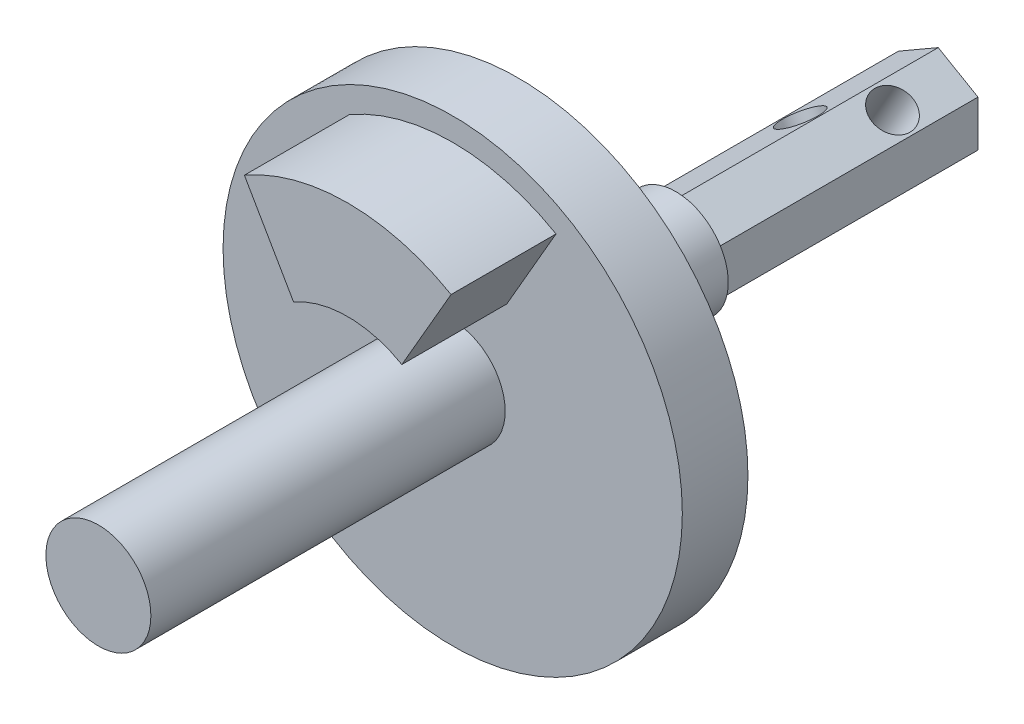
ISO-10303-21;
HEADER;
FILE_DESCRIPTION(('STEP AP214'),'2;1');
FILE_NAME('part.step','',(''),(''),'','','');
FILE_SCHEMA(('AUTOMOTIVE_DESIGN { 1 0 10303 214 1 1 1 1 }'));
ENDSEC;
DATA;
#1=APPLICATION_CONTEXT('core data for automotive mechanical design processes');
#2=APPLICATION_PROTOCOL_DEFINITION('international standard','automotive_design',2000,#1);
#3=PRODUCT_CONTEXT('',#1,'mechanical');
#4=PRODUCT('Part','Part','',(#3));
#5=PRODUCT_RELATED_PRODUCT_CATEGORY('part','',(#4));
#6=PRODUCT_DEFINITION_FORMATION('','',#4);
#7=PRODUCT_DEFINITION_CONTEXT('part definition',#1,'design');
#8=PRODUCT_DEFINITION('design','',#6,#7);
#9=PRODUCT_DEFINITION_SHAPE('','',#8);
#10=(LENGTH_UNIT() NAMED_UNIT(*) SI_UNIT(.MILLI.,.METRE.));
#11=(NAMED_UNIT(*) PLANE_ANGLE_UNIT() SI_UNIT($,.RADIAN.));
#12=(NAMED_UNIT(*) SI_UNIT($,.STERADIAN.) SOLID_ANGLE_UNIT());
#13=UNCERTAINTY_MEASURE_WITH_UNIT(LENGTH_MEASURE(1.E-05),#10,'distance_accuracy_value','');
#14=(GEOMETRIC_REPRESENTATION_CONTEXT(3) GLOBAL_UNCERTAINTY_ASSIGNED_CONTEXT((#13)) GLOBAL_UNIT_ASSIGNED_CONTEXT((#10,
#11,#12)) REPRESENTATION_CONTEXT('',''));
#15=CARTESIAN_POINT('',(0.,0.,0.));
#16=DIRECTION('',(0.,0.,1.));
#17=DIRECTION('',(1.,0.,0.));
#18=AXIS2_PLACEMENT_3D('',#15,#16,#17);
#19=CARTESIAN_POINT('',(0.,0.,2.5));
#20=DIRECTION('',(0.,0.,1.));
#21=DIRECTION('',(1.,0.,0.));
#22=AXIS2_PLACEMENT_3D('',#19,#20,#21);
#23=PLANE('',#22);
#24=CARTESIAN_POINT('',(0.,0.,2.5));
#25=DIRECTION('',(0.,0.,1.));
#26=DIRECTION('',(1.,0.,0.));
#27=AXIS2_PLACEMENT_3D('',#24,#25,#26);
#28=CIRCLE('',#27,4.);
#29=CARTESIAN_POINT('',(4.,0.,2.5));
#30=VERTEX_POINT('',#29);
#31=EDGE_CURVE('E147',#30,#30,#28,.T.);
#32=ORIENTED_EDGE('',*,*,#31,.F.);
#33=EDGE_LOOP('',(#32));
#34=FACE_BOUND('',#33,.T.);
#35=CARTESIAN_POINT('',(0.,0.,2.5));
#36=DIRECTION('',(0.,0.,1.));
#37=DIRECTION('',(1.,0.,0.));
#38=AXIS2_PLACEMENT_3D('',#35,#36,#37);
#39=CIRCLE('',#38,17.5);
#40=CARTESIAN_POINT('',(17.5,0.,2.5));
#41=VERTEX_POINT('',#40);
#42=EDGE_CURVE('E49',#41,#41,#39,.T.);
#43=ORIENTED_EDGE('',*,*,#42,.T.);
#44=EDGE_LOOP('',(#43));
#45=FACE_BOUND('',#44,.T.);
#46=DIRECTION('',(0.499999999999996,-0.866025403784441,0.));
#47=VECTOR('',#46,1.);
#48=CARTESIAN_POINT('',(-4.12499999999996,7.14470958122165,2.5));
#49=LINE('',#48,#47);
#50=CARTESIAN_POINT('',(-7.87499999999993,13.639900109605,2.5));
#51=VERTEX_POINT('',#50);
#52=CARTESIAN_POINT('',(-4.12499999999996,7.14470958122165,2.5));
#53=VERTEX_POINT('',#52);
#54=EDGE_CURVE('E179',#51,#53,#49,.T.);
#55=ORIENTED_EDGE('',*,*,#54,.F.);
#56=CARTESIAN_POINT('',(0.,0.,2.5));
#57=DIRECTION('',(0.,0.,1.));
#58=DIRECTION('',(-1.,0.,0.));
#59=AXIS2_PLACEMENT_3D('',#56,#57,#58);
#60=CIRCLE('',#59,15.75);
#61=CARTESIAN_POINT('',(7.87499999999993,13.639900109605,2.5));
#62=VERTEX_POINT('',#61);
#63=EDGE_CURVE('E157',#62,#51,#60,.T.);
#64=ORIENTED_EDGE('',*,*,#63,.F.);
#65=DIRECTION('',(0.499999999999995,0.866025403784441,0.));
#66=VECTOR('',#65,1.);
#67=CARTESIAN_POINT('',(7.87499999999993,13.639900109605,2.5));
#68=LINE('',#67,#66);
#69=CARTESIAN_POINT('',(4.12499999999996,7.14470958122164,2.5));
#70=VERTEX_POINT('',#69);
#71=EDGE_CURVE('E166',#70,#62,#68,.T.);
#72=ORIENTED_EDGE('',*,*,#71,.F.);
#73=CARTESIAN_POINT('',(0.,0.,2.5));
#74=DIRECTION('',(0.,0.,-1.));
#75=DIRECTION('',(1.,0.,0.));
#76=AXIS2_PLACEMENT_3D('',#73,#74,#75);
#77=CIRCLE('',#76,8.25);
#78=EDGE_CURVE('E182',#53,#70,#77,.T.);
#79=ORIENTED_EDGE('',*,*,#78,.F.);
#80=EDGE_LOOP('',(#55,#64,#72,#79));
#81=FACE_BOUND('',#80,.T.);
#82=ADVANCED_FACE('F39',(#34,#45,#81),#23,.T.);
#83=CARTESIAN_POINT('',(0.,0.,2.5));
#84=DIRECTION('',(0.,0.,-1.));
#85=DIRECTION('',(-1.,0.,0.));
#86=AXIS2_PLACEMENT_3D('',#83,#84,#85);
#87=CYLINDRICAL_SURFACE('',#86,17.5);
#88=ORIENTED_EDGE('',*,*,#42,.F.);
#89=EDGE_LOOP('',(#88));
#90=FACE_BOUND('',#89,.T.);
#91=CARTESIAN_POINT('',(0.,0.,-2.5));
#92=DIRECTION('',(0.,0.,1.));
#93=DIRECTION('',(1.,0.,0.));
#94=AXIS2_PLACEMENT_3D('',#91,#92,#93);
#95=CIRCLE('',#94,17.5);
#96=CARTESIAN_POINT('',(17.5,0.,-2.5));
#97=VERTEX_POINT('',#96);
#98=EDGE_CURVE('E43',#97,#97,#95,.T.);
#99=ORIENTED_EDGE('',*,*,#98,.T.);
#100=EDGE_LOOP('',(#99));
#101=FACE_BOUND('',#100,.T.);
#102=ADVANCED_FACE('F41',(#90,#101),#87,.T.);
#103=CARTESIAN_POINT('',(0.,0.,-2.5));
#104=DIRECTION('',(0.,0.,1.));
#105=DIRECTION('',(1.,0.,0.));
#106=AXIS2_PLACEMENT_3D('',#103,#104,#105);
#107=PLANE('',#106);
#108=CARTESIAN_POINT('',(0.,0.,-2.5));
#109=DIRECTION('',(0.,0.,-1.));
#110=DIRECTION('',(-1.,0.,0.));
#111=AXIS2_PLACEMENT_3D('',#108,#109,#110);
#112=CIRCLE('',#111,4.);
#113=CARTESIAN_POINT('',(-4.,0.,-2.5));
#114=VERTEX_POINT('',#113);
#115=EDGE_CURVE('E11',#114,#114,#112,.T.);
#116=ORIENTED_EDGE('',*,*,#115,.F.);
#117=EDGE_LOOP('',(#116));
#118=FACE_BOUND('',#117,.T.);
#119=ORIENTED_EDGE('',*,*,#98,.F.);
#120=EDGE_LOOP('',(#119));
#121=FACE_BOUND('',#120,.T.);
#122=ADVANCED_FACE('F209',(#118,#121),#107,.F.);
#123=CARTESIAN_POINT('',(0.,0.,10.5));
#124=DIRECTION('',(0.,0.,-1.));
#125=DIRECTION('',(-1.,0.,0.));
#126=AXIS2_PLACEMENT_3D('',#123,#124,#125);
#127=CYLINDRICAL_SURFACE('',#126,15.75);
#128=ORIENTED_EDGE('',*,*,#63,.T.);
#129=DIRECTION('',(0.,0.,-1.));
#130=VECTOR('',#129,1.);
#131=CARTESIAN_POINT('',(-7.87499999999993,13.639900109605,10.5));
#132=LINE('',#131,#130);
#133=CARTESIAN_POINT('',(-7.87499999999993,13.639900109605,10.5));
#134=VERTEX_POINT('',#133);
#135=EDGE_CURVE('E198',#134,#51,#132,.T.);
#136=ORIENTED_EDGE('',*,*,#135,.F.);
#137=CARTESIAN_POINT('',(0.,0.,10.5));
#138=DIRECTION('',(0.,0.,1.));
#139=DIRECTION('',(-1.,0.,0.));
#140=AXIS2_PLACEMENT_3D('',#137,#138,#139);
#141=CIRCLE('',#140,15.75);
#142=CARTESIAN_POINT('',(7.87499999999993,13.639900109605,10.5));
#143=VERTEX_POINT('',#142);
#144=EDGE_CURVE('E161',#143,#134,#141,.T.);
#145=ORIENTED_EDGE('',*,*,#144,.F.);
#146=DIRECTION('',(0.,0.,-1.));
#147=VECTOR('',#146,1.);
#148=CARTESIAN_POINT('',(7.87499999999993,13.639900109605,10.5));
#149=LINE('',#148,#147);
#150=EDGE_CURVE('E175',#143,#62,#149,.T.);
#151=ORIENTED_EDGE('',*,*,#150,.T.);
#152=EDGE_LOOP('',(#128,#136,#145,#151));
#153=FACE_BOUND('',#152,.T.);
#154=ADVANCED_FACE('F211',(#153),#127,.T.);
#155=CARTESIAN_POINT('',(-4.12499999999996,7.14470958122165,10.5));
#156=DIRECTION('',(0.866025403784441,0.499999999999996,0.));
#157=DIRECTION('',(-0.499999999999996,0.866025403784441,0.));
#158=AXIS2_PLACEMENT_3D('',#155,#156,#157);
#159=PLANE('',#158);
#160=ORIENTED_EDGE('',*,*,#54,.T.);
#161=DIRECTION('',(0.,0.,-1.));
#162=VECTOR('',#161,1.);
#163=CARTESIAN_POINT('',(-4.12499999999996,7.14470958122165,10.5));
#164=LINE('',#163,#162);
#165=CARTESIAN_POINT('',(-4.12499999999996,7.14470958122165,10.5));
#166=VERTEX_POINT('',#165);
#167=EDGE_CURVE('E194',#166,#53,#164,.T.);
#168=ORIENTED_EDGE('',*,*,#167,.F.);
#169=DIRECTION('',(0.499999999999996,-0.866025403784441,0.));
#170=VECTOR('',#169,1.);
#171=CARTESIAN_POINT('',(-4.12499999999996,7.14470958122165,10.5));
#172=LINE('',#171,#170);
#173=EDGE_CURVE('E165',#134,#166,#172,.T.);
#174=ORIENTED_EDGE('',*,*,#173,.F.);
#175=ORIENTED_EDGE('',*,*,#135,.T.);
#176=EDGE_LOOP('',(#160,#168,#174,#175));
#177=FACE_BOUND('',#176,.T.);
#178=ADVANCED_FACE('F217',(#177),#159,.F.);
#179=CARTESIAN_POINT('',(0.,0.,10.5));
#180=DIRECTION('',(0.,0.,-1.));
#181=DIRECTION('',(-1.,0.,0.));
#182=AXIS2_PLACEMENT_3D('',#179,#180,#181);
#183=CYLINDRICAL_SURFACE('',#182,8.25);
#184=ORIENTED_EDGE('',*,*,#78,.T.);
#185=DIRECTION('',(0.,0.,-1.));
#186=VECTOR('',#185,1.);
#187=CARTESIAN_POINT('',(4.12499999999996,7.14470958122164,10.5));
#188=LINE('',#187,#186);
#189=CARTESIAN_POINT('',(4.12499999999996,7.14470958122164,10.5));
#190=VERTEX_POINT('',#189);
#191=EDGE_CURVE('E191',#190,#70,#188,.T.);
#192=ORIENTED_EDGE('',*,*,#191,.F.);
#193=CARTESIAN_POINT('',(0.,0.,10.5));
#194=DIRECTION('',(0.,0.,-1.));
#195=DIRECTION('',(1.,0.,0.));
#196=AXIS2_PLACEMENT_3D('',#193,#194,#195);
#197=CIRCLE('',#196,8.25);
#198=EDGE_CURVE('E169',#166,#190,#197,.T.);
#199=ORIENTED_EDGE('',*,*,#198,.F.);
#200=ORIENTED_EDGE('',*,*,#167,.T.);
#201=EDGE_LOOP('',(#184,#192,#199,#200));
#202=FACE_BOUND('',#201,.T.);
#203=ADVANCED_FACE('F231',(#202),#183,.F.);
#204=CARTESIAN_POINT('',(7.87499999999993,13.639900109605,10.5));
#205=DIRECTION('',(-0.866025403784441,0.499999999999995,0.));
#206=DIRECTION('',(-0.499999999999995,-0.866025403784441,0.));
#207=AXIS2_PLACEMENT_3D('',#204,#205,#206);
#208=PLANE('',#207);
#209=ORIENTED_EDGE('',*,*,#71,.T.);
#210=ORIENTED_EDGE('',*,*,#150,.F.);
#211=DIRECTION('',(0.499999999999995,0.866025403784441,0.));
#212=VECTOR('',#211,1.);
#213=CARTESIAN_POINT('',(7.87499999999993,13.639900109605,10.5));
#214=LINE('',#213,#212);
#215=EDGE_CURVE('E172',#190,#143,#214,.T.);
#216=ORIENTED_EDGE('',*,*,#215,.F.);
#217=ORIENTED_EDGE('',*,*,#191,.T.);
#218=EDGE_LOOP('',(#209,#210,#216,#217));
#219=FACE_BOUND('',#218,.T.);
#220=ADVANCED_FACE('F235',(#219),#208,.F.);
#221=CARTESIAN_POINT('',(0.,0.,10.5));
#222=DIRECTION('',(0.,0.,-1.));
#223=DIRECTION('',(-1.,0.,0.));
#224=AXIS2_PLACEMENT_3D('',#221,#222,#223);
#225=PLANE('',#224);
#226=ORIENTED_EDGE('',*,*,#144,.T.);
#227=ORIENTED_EDGE('',*,*,#173,.T.);
#228=ORIENTED_EDGE('',*,*,#198,.T.);
#229=ORIENTED_EDGE('',*,*,#215,.T.);
#230=EDGE_LOOP('',(#226,#227,#228,#229));
#231=FACE_BOUND('',#230,.T.);
#232=ADVANCED_FACE('F239',(#231),#225,.F.);
#233=CARTESIAN_POINT('',(0.,0.,29.5));
#234=DIRECTION('',(0.,0.,-1.));
#235=DIRECTION('',(-1.,0.,0.));
#236=AXIS2_PLACEMENT_3D('',#233,#234,#235);
#237=CYLINDRICAL_SURFACE('',#236,4.);
#238=CARTESIAN_POINT('',(0.,0.,29.5));
#239=DIRECTION('',(0.,0.,1.));
#240=DIRECTION('',(1.,0.,0.));
#241=AXIS2_PLACEMENT_3D('',#238,#239,#240);
#242=CIRCLE('',#241,4.);
#243=CARTESIAN_POINT('',(4.,0.,29.5));
#244=VERTEX_POINT('',#243);
#245=EDGE_CURVE('E153',#244,#244,#242,.T.);
#246=ORIENTED_EDGE('',*,*,#245,.F.);
#247=EDGE_LOOP('',(#246));
#248=FACE_BOUND('',#247,.T.);
#249=ORIENTED_EDGE('',*,*,#31,.T.);
#250=EDGE_LOOP('',(#249));
#251=FACE_BOUND('',#250,.T.);
#252=ADVANCED_FACE('F243',(#248,#251),#237,.T.);
#253=CARTESIAN_POINT('',(0.,0.,29.5));
#254=DIRECTION('',(0.,0.,1.));
#255=DIRECTION('',(1.,0.,0.));
#256=AXIS2_PLACEMENT_3D('',#253,#254,#255);
#257=PLANE('',#256);
#258=ORIENTED_EDGE('',*,*,#245,.T.);
#259=EDGE_LOOP('',(#258));
#260=FACE_BOUND('',#259,.T.);
#261=ADVANCED_FACE('F247',(#260),#257,.T.);
#262=CARTESIAN_POINT('',(0.,0.,-14.5));
#263=DIRECTION('',(0.,0.,1.));
#264=DIRECTION('',(1.,0.,0.));
#265=AXIS2_PLACEMENT_3D('',#262,#263,#264);
#266=CYLINDRICAL_SURFACE('',#265,4.);
#267=CARTESIAN_POINT('',(0.,0.,-14.5));
#268=DIRECTION('',(0.,0.,-1.));
#269=DIRECTION('',(-1.,0.,0.));
#270=AXIS2_PLACEMENT_3D('',#267,#268,#269);
#271=CIRCLE('',#270,4.);
#272=CARTESIAN_POINT('',(-4.,0.,-14.5));
#273=VERTEX_POINT('',#272);
#274=EDGE_CURVE('E142',#273,#273,#271,.T.);
#275=ORIENTED_EDGE('',*,*,#274,.F.);
#276=EDGE_LOOP('',(#275));
#277=FACE_BOUND('',#276,.T.);
#278=ORIENTED_EDGE('',*,*,#115,.T.);
#279=EDGE_LOOP('',(#278));
#280=FACE_BOUND('',#279,.T.);
#281=ADVANCED_FACE('F251',(#277,#280),#266,.T.);
#282=CARTESIAN_POINT('',(0.,0.,-14.5));
#283=DIRECTION('',(0.,0.,-1.));
#284=DIRECTION('',(-1.,0.,0.));
#285=AXIS2_PLACEMENT_3D('',#282,#283,#284);
#286=PLANE('',#285);
#287=DIRECTION('',(0.86602540378444,0.499999999999997,0.));
#288=VECTOR('',#287,1.);
#289=CARTESIAN_POINT('',(-3.03108891324554,1.75000000000003,-14.5));
#290=LINE('',#289,#288);
#291=CARTESIAN_POINT('',(-3.03108891324554,1.75000000000003,-14.5));
#292=VERTEX_POINT('',#291);
#293=CARTESIAN_POINT('',(0.,3.50000000000002,-14.5));
#294=VERTEX_POINT('',#293);
#295=EDGE_CURVE('E57',#292,#294,#290,.T.);
#296=ORIENTED_EDGE('',*,*,#295,.F.);
#297=DIRECTION('',(0.,1.,0.));
#298=VECTOR('',#297,1.);
#299=CARTESIAN_POINT('',(-3.03108891324552,-1.75,-14.5));
#300=LINE('',#299,#298);
#301=CARTESIAN_POINT('',(-3.03108891324552,-1.75,-14.5));
#302=VERTEX_POINT('',#301);
#303=EDGE_CURVE('E61',#302,#292,#300,.T.);
#304=ORIENTED_EDGE('',*,*,#303,.F.);
#305=DIRECTION('',(-0.866025403784435,0.500000000000006,0.));
#306=VECTOR('',#305,1.);
#307=CARTESIAN_POINT('',(0.,-3.50000000000002,-14.5));
#308=LINE('',#307,#306);
#309=CARTESIAN_POINT('',(0.,-3.50000000000002,-14.5));
#310=VERTEX_POINT('',#309);
#311=EDGE_CURVE('E336',#310,#302,#308,.T.);
#312=ORIENTED_EDGE('',*,*,#311,.F.);
#313=DIRECTION('',(-0.86602540378444,-0.499999999999997,0.));
#314=VECTOR('',#313,1.);
#315=CARTESIAN_POINT('',(3.03108891324554,-1.75000000000003,-14.5));
#316=LINE('',#315,#314);
#317=CARTESIAN_POINT('',(3.03108891324554,-1.75000000000003,-14.5));
#318=VERTEX_POINT('',#317);
#319=EDGE_CURVE('E332',#318,#310,#316,.T.);
#320=ORIENTED_EDGE('',*,*,#319,.F.);
#321=DIRECTION('',(0.,-1.,0.));
#322=VECTOR('',#321,1.);
#323=CARTESIAN_POINT('',(3.03108891324554,1.74999999999999,-14.5));
#324=LINE('',#323,#322);
#325=CARTESIAN_POINT('',(3.03108891324554,1.74999999999999,-14.5));
#326=VERTEX_POINT('',#325);
#327=EDGE_CURVE('E328',#326,#318,#324,.T.);
#328=ORIENTED_EDGE('',*,*,#327,.F.);
#329=DIRECTION('',(0.866025403784435,-0.500000000000007,0.));
#330=VECTOR('',#329,1.);
#331=CARTESIAN_POINT('',(0.,3.50000000000002,-14.5));
#332=LINE('',#331,#330);
#333=EDGE_CURVE('E325',#294,#326,#332,.T.);
#334=ORIENTED_EDGE('',*,*,#333,.F.);
#335=EDGE_LOOP('',(#296,#304,#312,#320,#328,#334));
#336=FACE_BOUND('',#335,.T.);
#337=ORIENTED_EDGE('',*,*,#274,.T.);
#338=EDGE_LOOP('',(#337));
#339=FACE_BOUND('',#338,.T.);
#340=ADVANCED_FACE('F255',(#336,#339),#286,.T.);
#341=CARTESIAN_POINT('',(-3.03108891324554,1.75000000000003,-34.5));
#342=DIRECTION('',(0.499999999999997,-0.86602540378444,0.));
#343=DIRECTION('',(0.86602540378444,0.499999999999997,0.));
#344=AXIS2_PLACEMENT_3D('',#341,#342,#343);
#345=PLANE('',#344);
#346=CARTESIAN_POINT('',(-1.51554445662277,2.62500000000003,-25.5));
#347=DIRECTION('',(0.499999999999997,-0.86602540378444,0.));
#348=DIRECTION('',(0.86602540378444,0.499999999999997,0.));
#349=AXIS2_PLACEMENT_3D('',#346,#347,#348);
#350=CIRCLE('',#349,1.55);
#351=CARTESIAN_POINT('',(-0.173205080756888,3.40000000000002,-25.5));
#352=VERTEX_POINT('',#351);
#353=EDGE_CURVE('E298',#352,#352,#350,.F.);
#354=ORIENTED_EDGE('',*,*,#353,.F.);
#355=EDGE_LOOP('',(#354));
#356=FACE_BOUND('',#355,.T.);
#357=ORIENTED_EDGE('',*,*,#295,.T.);
#358=DIRECTION('',(0.,0.,1.));
#359=VECTOR('',#358,1.);
#360=CARTESIAN_POINT('',(0.,3.50000000000002,-34.5));
#361=LINE('',#360,#359);
#362=CARTESIAN_POINT('',(0.,3.50000000000002,-34.5));
#363=VERTEX_POINT('',#362);
#364=EDGE_CURVE('E122',#363,#294,#361,.T.);
#365=ORIENTED_EDGE('',*,*,#364,.F.);
#366=DIRECTION('',(0.86602540378444,0.499999999999997,0.));
#367=VECTOR('',#366,1.);
#368=CARTESIAN_POINT('',(-3.03108891324554,1.75000000000003,-34.5));
#369=LINE('',#368,#367);
#370=CARTESIAN_POINT('',(-3.03108891324554,1.75000000000003,-34.5));
#371=VERTEX_POINT('',#370);
#372=EDGE_CURVE('E129',#371,#363,#369,.T.);
#373=ORIENTED_EDGE('',*,*,#372,.F.);
#374=DIRECTION('',(0.,0.,1.));
#375=VECTOR('',#374,1.);
#376=CARTESIAN_POINT('',(-3.03108891324554,1.75000000000003,-34.5));
#377=LINE('',#376,#375);
#378=EDGE_CURVE('E322',#371,#292,#377,.T.);
#379=ORIENTED_EDGE('',*,*,#378,.T.);
#380=EDGE_LOOP('',(#357,#365,#373,#379));
#381=FACE_BOUND('',#380,.T.);
#382=ADVANCED_FACE('F140',(#356,#381),#345,.F.);
#383=CARTESIAN_POINT('',(0.,3.50000000000002,-34.5));
#384=DIRECTION('',(-0.500000000000007,-0.866025403784435,0.));
#385=DIRECTION('',(0.866025403784435,-0.500000000000007,0.));
#386=AXIS2_PLACEMENT_3D('',#383,#384,#385);
#387=PLANE('',#386);
#388=CARTESIAN_POINT('',(1.51554445662279,2.625,-29.5));
#389=DIRECTION('',(-0.500000000000007,-0.866025403784435,0.));
#390=DIRECTION('',(0.866025403784435,-0.500000000000007,0.));
#391=AXIS2_PLACEMENT_3D('',#388,#389,#390);
#392=CIRCLE('',#391,1.55000000000003);
#393=CARTESIAN_POINT('',(2.85788383248869,1.84999999999997,-29.5));
#394=VERTEX_POINT('',#393);
#395=EDGE_CURVE('E305',#394,#394,#392,.T.);
#396=ORIENTED_EDGE('',*,*,#395,.T.);
#397=EDGE_LOOP('',(#396));
#398=FACE_BOUND('',#397,.T.);
#399=ORIENTED_EDGE('',*,*,#333,.T.);
#400=DIRECTION('',(0.,0.,1.));
#401=VECTOR('',#400,1.);
#402=CARTESIAN_POINT('',(3.03108891324554,1.74999999999999,-34.5));
#403=LINE('',#402,#401);
#404=CARTESIAN_POINT('',(3.03108891324554,1.74999999999999,-34.5));
#405=VERTEX_POINT('',#404);
#406=EDGE_CURVE('E124',#405,#326,#403,.T.);
#407=ORIENTED_EDGE('',*,*,#406,.F.);
#408=DIRECTION('',(0.866025403784435,-0.500000000000007,0.));
#409=VECTOR('',#408,1.);
#410=CARTESIAN_POINT('',(0.,3.50000000000002,-34.5));
#411=LINE('',#410,#409);
#412=EDGE_CURVE('E117',#363,#405,#411,.T.);
#413=ORIENTED_EDGE('',*,*,#412,.F.);
#414=ORIENTED_EDGE('',*,*,#364,.T.);
#415=EDGE_LOOP('',(#399,#407,#413,#414));
#416=FACE_BOUND('',#415,.T.);
#417=ADVANCED_FACE('F120',(#398,#416),#387,.F.);
#418=CARTESIAN_POINT('',(3.03108891324554,1.74999999999999,-34.5));
#419=DIRECTION('',(-1.,0.,0.));
#420=DIRECTION('',(0.,-1.,0.));
#421=AXIS2_PLACEMENT_3D('',#418,#419,#420);
#422=PLANE('',#421);
#423=ORIENTED_EDGE('',*,*,#327,.T.);
#424=DIRECTION('',(0.,0.,1.));
#425=VECTOR('',#424,1.);
#426=CARTESIAN_POINT('',(3.03108891324554,-1.75000000000003,-34.5));
#427=LINE('',#426,#425);
#428=CARTESIAN_POINT('',(3.03108891324554,-1.75000000000003,-34.5));
#429=VERTEX_POINT('',#428);
#430=EDGE_CURVE('E149',#429,#318,#427,.T.);
#431=ORIENTED_EDGE('',*,*,#430,.F.);
#432=DIRECTION('',(0.,-1.,0.));
#433=VECTOR('',#432,1.);
#434=CARTESIAN_POINT('',(3.03108891324554,1.74999999999999,-34.5));
#435=LINE('',#434,#433);
#436=EDGE_CURVE('E128',#405,#429,#435,.T.);
#437=ORIENTED_EDGE('',*,*,#436,.F.);
#438=ORIENTED_EDGE('',*,*,#406,.T.);
#439=EDGE_LOOP('',(#423,#431,#437,#438));
#440=FACE_BOUND('',#439,.T.);
#441=ADVANCED_FACE('F264',(#440),#422,.F.);
#442=CARTESIAN_POINT('',(3.03108891324554,-1.75000000000003,-34.5));
#443=DIRECTION('',(-0.499999999999997,0.86602540378444,0.));
#444=DIRECTION('',(-0.86602540378444,-0.499999999999997,0.));
#445=AXIS2_PLACEMENT_3D('',#442,#443,#444);
#446=PLANE('',#445);
#447=CARTESIAN_POINT('',(1.51554445662277,-2.62500000000003,-25.5));
#448=DIRECTION('',(-0.499999999999997,0.86602540378444,0.));
#449=DIRECTION('',(-0.86602540378444,-0.499999999999997,0.));
#450=AXIS2_PLACEMENT_3D('',#447,#448,#449);
#451=CIRCLE('',#450,1.55);
#452=CARTESIAN_POINT('',(0.173205080756889,-3.40000000000002,-25.5));
#453=VERTEX_POINT('',#452);
#454=EDGE_CURVE('E295',#453,#453,#451,.T.);
#455=ORIENTED_EDGE('',*,*,#454,.T.);
#456=EDGE_LOOP('',(#455));
#457=FACE_BOUND('',#456,.T.);
#458=ORIENTED_EDGE('',*,*,#319,.T.);
#459=DIRECTION('',(0.,0.,1.));
#460=VECTOR('',#459,1.);
#461=CARTESIAN_POINT('',(0.,-3.50000000000002,-34.5));
#462=LINE('',#461,#460);
#463=CARTESIAN_POINT('',(0.,-3.50000000000002,-34.5));
#464=VERTEX_POINT('',#463);
#465=EDGE_CURVE('E347',#464,#310,#462,.T.);
#466=ORIENTED_EDGE('',*,*,#465,.F.);
#467=DIRECTION('',(-0.86602540378444,-0.499999999999997,0.));
#468=VECTOR('',#467,1.);
#469=CARTESIAN_POINT('',(3.03108891324554,-1.75000000000003,-34.5));
#470=LINE('',#469,#468);
#471=EDGE_CURVE('E314',#429,#464,#470,.T.);
#472=ORIENTED_EDGE('',*,*,#471,.F.);
#473=ORIENTED_EDGE('',*,*,#430,.T.);
#474=EDGE_LOOP('',(#458,#466,#472,#473));
#475=FACE_BOUND('',#474,.T.);
#476=ADVANCED_FACE('F268',(#457,#475),#446,.F.);
#477=CARTESIAN_POINT('',(0.,-3.50000000000002,-34.5));
#478=DIRECTION('',(0.500000000000006,0.866025403784435,0.));
#479=DIRECTION('',(-0.866025403784435,0.500000000000006,0.));
#480=AXIS2_PLACEMENT_3D('',#477,#478,#479);
#481=PLANE('',#480);
#482=CARTESIAN_POINT('',(-1.51554445662279,-2.625,-29.5));
#483=DIRECTION('',(-0.500000000000006,-0.866025403784435,0.));
#484=DIRECTION('',(0.866025403784435,-0.500000000000006,0.));
#485=AXIS2_PLACEMENT_3D('',#482,#483,#484);
#486=CIRCLE('',#485,1.55000000000003);
#487=CARTESIAN_POINT('',(-0.173205080756887,-3.40000000000002,-29.5));
#488=VERTEX_POINT('',#487);
#489=EDGE_CURVE('E300',#488,#488,#486,.T.);
#490=ORIENTED_EDGE('',*,*,#489,.F.);
#491=EDGE_LOOP('',(#490));
#492=FACE_BOUND('',#491,.T.);
#493=ORIENTED_EDGE('',*,*,#311,.T.);
#494=DIRECTION('',(0.,0.,1.));
#495=VECTOR('',#494,1.);
#496=CARTESIAN_POINT('',(-3.03108891324552,-1.75,-34.5));
#497=LINE('',#496,#495);
#498=CARTESIAN_POINT('',(-3.03108891324552,-1.75,-34.5));
#499=VERTEX_POINT('',#498);
#500=EDGE_CURVE('E343',#499,#302,#497,.T.);
#501=ORIENTED_EDGE('',*,*,#500,.F.);
#502=DIRECTION('',(-0.866025403784435,0.500000000000006,0.));
#503=VECTOR('',#502,1.);
#504=CARTESIAN_POINT('',(0.,-3.50000000000002,-34.5));
#505=LINE('',#504,#503);
#506=EDGE_CURVE('E317',#464,#499,#505,.T.);
#507=ORIENTED_EDGE('',*,*,#506,.F.);
#508=ORIENTED_EDGE('',*,*,#465,.T.);
#509=EDGE_LOOP('',(#493,#501,#507,#508));
#510=FACE_BOUND('',#509,.T.);
#511=ADVANCED_FACE('F272',(#492,#510),#481,.F.);
#512=CARTESIAN_POINT('',(-3.03108891324552,-1.75,-34.5));
#513=DIRECTION('',(1.,0.,0.));
#514=DIRECTION('',(0.,1.,0.));
#515=AXIS2_PLACEMENT_3D('',#512,#513,#514);
#516=PLANE('',#515);
#517=ORIENTED_EDGE('',*,*,#303,.T.);
#518=ORIENTED_EDGE('',*,*,#378,.F.);
#519=DIRECTION('',(0.,1.,0.));
#520=VECTOR('',#519,1.);
#521=CARTESIAN_POINT('',(-3.03108891324552,-1.75,-34.5));
#522=LINE('',#521,#520);
#523=EDGE_CURVE('E134',#499,#371,#522,.T.);
#524=ORIENTED_EDGE('',*,*,#523,.F.);
#525=ORIENTED_EDGE('',*,*,#500,.T.);
#526=EDGE_LOOP('',(#517,#518,#524,#525));
#527=FACE_BOUND('',#526,.T.);
#528=ADVANCED_FACE('F276',(#527),#516,.F.);
#529=CARTESIAN_POINT('',(0.,0.,-34.5));
#530=DIRECTION('',(0.,0.,-1.));
#531=DIRECTION('',(-1.,0.,0.));
#532=AXIS2_PLACEMENT_3D('',#529,#530,#531);
#533=PLANE('',#532);
#534=ORIENTED_EDGE('',*,*,#372,.T.);
#535=ORIENTED_EDGE('',*,*,#412,.T.);
#536=ORIENTED_EDGE('',*,*,#436,.T.);
#537=ORIENTED_EDGE('',*,*,#471,.T.);
#538=ORIENTED_EDGE('',*,*,#506,.T.);
#539=ORIENTED_EDGE('',*,*,#523,.T.);
#540=EDGE_LOOP('',(#534,#535,#536,#537,#538,#539));
#541=FACE_BOUND('',#540,.T.);
#542=ADVANCED_FACE('F132',(#541),#533,.T.);
#543=CARTESIAN_POINT('',(1.53445554337725,2.65775496308506,-29.5));
#544=DIRECTION('',(-0.500000000000006,-0.866025403784435,0.));
#545=DIRECTION('',(0.866025403784435,-0.500000000000006,0.));
#546=AXIS2_PLACEMENT_3D('',#543,#544,#545);
#547=CYLINDRICAL_SURFACE('',#546,1.55000000000003);
#548=ORIENTED_EDGE('',*,*,#489,.T.);
#549=EDGE_LOOP('',(#548));
#550=FACE_BOUND('',#549,.T.);
#551=ORIENTED_EDGE('',*,*,#395,.F.);
#552=EDGE_LOOP('',(#551));
#553=FACE_BOUND('',#552,.T.);
#554=ADVANCED_FACE('F283',(#550,#553),#547,.F.);
#555=CARTESIAN_POINT('',(-1.53445554337721,2.65775496308506,-25.5));
#556=DIRECTION('',(0.499999999999997,-0.86602540378444,0.));
#557=DIRECTION('',(0.86602540378444,0.499999999999997,0.));
#558=AXIS2_PLACEMENT_3D('',#555,#556,#557);
#559=CYLINDRICAL_SURFACE('',#558,1.55);
#560=ORIENTED_EDGE('',*,*,#454,.F.);
#561=EDGE_LOOP('',(#560));
#562=FACE_BOUND('',#561,.T.);
#563=ORIENTED_EDGE('',*,*,#353,.T.);
#564=EDGE_LOOP('',(#563));
#565=FACE_BOUND('',#564,.T.);
#566=ADVANCED_FACE('F286',(#562,#565),#559,.F.);
#567=CLOSED_SHELL('',(#82,#102,#122,#154,#178,#203,#220,#232,#252,#261,#281,#340,#382,#417,#441,
#476,#511,#528,#542,#554,#566));
#568=MANIFOLD_SOLID_BREP('B2',#567);
#569=ADVANCED_BREP_SHAPE_REPRESENTATION('',(#18,#568),#14);
#570=SHAPE_DEFINITION_REPRESENTATION(#9,#569);
ENDSEC;
END-ISO-10303-21;
